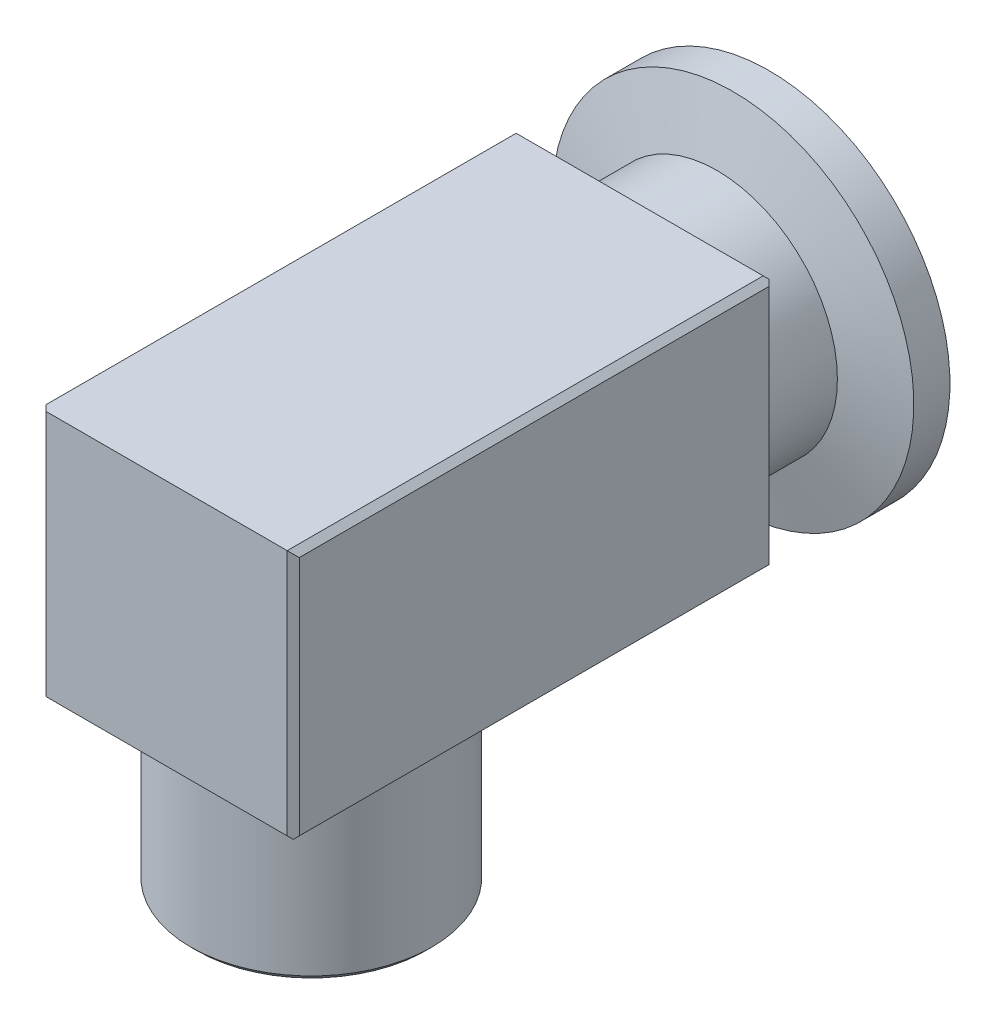
ISO-10303-21;
HEADER;
FILE_DESCRIPTION(('STEP AP214'),'2;1');
FILE_NAME('part.step','',(''),(''),'','','');
FILE_SCHEMA(('AUTOMOTIVE_DESIGN { 1 0 10303 214 1 1 1 1 }'));
ENDSEC;
DATA;
#1=APPLICATION_CONTEXT('core data for automotive mechanical design processes');
#2=APPLICATION_PROTOCOL_DEFINITION('international standard','automotive_design',2000,#1);
#3=PRODUCT_CONTEXT('',#1,'mechanical');
#4=PRODUCT('Part','Part','',(#3));
#5=PRODUCT_RELATED_PRODUCT_CATEGORY('part','',(#4));
#6=PRODUCT_DEFINITION_FORMATION('','',#4);
#7=PRODUCT_DEFINITION_CONTEXT('part definition',#1,'design');
#8=PRODUCT_DEFINITION('design','',#6,#7);
#9=PRODUCT_DEFINITION_SHAPE('','',#8);
#10=(LENGTH_UNIT() NAMED_UNIT(*) SI_UNIT(.MILLI.,.METRE.));
#11=(NAMED_UNIT(*) PLANE_ANGLE_UNIT() SI_UNIT($,.RADIAN.));
#12=(NAMED_UNIT(*) SI_UNIT($,.STERADIAN.) SOLID_ANGLE_UNIT());
#13=UNCERTAINTY_MEASURE_WITH_UNIT(LENGTH_MEASURE(1.E-05),#10,'distance_accuracy_value','');
#14=(GEOMETRIC_REPRESENTATION_CONTEXT(3) GLOBAL_UNCERTAINTY_ASSIGNED_CONTEXT((#13)) GLOBAL_UNIT_ASSIGNED_CONTEXT((#10,
#11,#12)) REPRESENTATION_CONTEXT('',''));
#15=CARTESIAN_POINT('',(0.,0.,0.));
#16=DIRECTION('',(0.,0.,1.));
#17=DIRECTION('',(1.,0.,0.));
#18=AXIS2_PLACEMENT_3D('',#15,#16,#17);
#19=CARTESIAN_POINT('',(10.25,-1.,-19.75));
#20=DIRECTION('',(0.707106781186548,0.,-0.707106781186548));
#21=DIRECTION('',(0.,-1.,0.));
#22=AXIS2_PLACEMENT_3D('',#19,#20,#21);
#23=PLANE('',#22);
#24=DIRECTION('',(0.,-1.,0.));
#25=VECTOR('',#24,1.);
#26=CARTESIAN_POINT('',(10.,9.,-20.));
#27=LINE('',#26,#25);
#28=CARTESIAN_POINT('',(10.,9.,-20.));
#29=VERTEX_POINT('',#28);
#30=CARTESIAN_POINT('',(10.,-1.,-20.));
#31=VERTEX_POINT('',#30);
#32=EDGE_CURVE('E231',#29,#31,#27,.T.);
#33=ORIENTED_EDGE('',*,*,#32,.F.);
#34=DIRECTION('',(-0.577350269189626,-0.577350269189626,-0.577350269189626));
#35=VECTOR('',#34,1.);
#36=CARTESIAN_POINT('',(10.25,9.25,-19.75));
#37=LINE('',#36,#35);
#38=CARTESIAN_POINT('',(10.25,9.25,-19.75));
#39=VERTEX_POINT('',#38);
#40=EDGE_CURVE('E219',#39,#29,#37,.T.);
#41=ORIENTED_EDGE('',*,*,#40,.F.);
#42=DIRECTION('',(-0.577350269189626,0.577350269189626,-0.577350269189626));
#43=VECTOR('',#42,1.);
#44=CARTESIAN_POINT('',(10.5,9.,-19.5));
#45=LINE('',#44,#43);
#46=CARTESIAN_POINT('',(10.5,9.,-19.5));
#47=VERTEX_POINT('',#46);
#48=EDGE_CURVE('E11',#47,#39,#45,.T.);
#49=ORIENTED_EDGE('',*,*,#48,.F.);
#50=DIRECTION('',(0.,-1.,0.));
#51=VECTOR('',#50,1.);
#52=CARTESIAN_POINT('',(10.5,9.,-19.5));
#53=LINE('',#52,#51);
#54=CARTESIAN_POINT('',(10.5,-11.,-19.5));
#55=VERTEX_POINT('',#54);
#56=EDGE_CURVE('E244',#47,#55,#53,.T.);
#57=ORIENTED_EDGE('',*,*,#56,.T.);
#58=DIRECTION('',(-0.577350269189626,-0.577350269189626,-0.577350269189626));
#59=VECTOR('',#58,1.);
#60=CARTESIAN_POINT('',(10.5,-11.,-19.5));
#61=LINE('',#60,#59);
#62=CARTESIAN_POINT('',(10.25,-11.25,-19.75));
#63=VERTEX_POINT('',#62);
#64=EDGE_CURVE('E223',#55,#63,#61,.T.);
#65=ORIENTED_EDGE('',*,*,#64,.T.);
#66=DIRECTION('',(-0.577350269189626,0.577350269189626,-0.577350269189626));
#67=VECTOR('',#66,1.);
#68=CARTESIAN_POINT('',(10.25,-11.25,-19.75));
#69=LINE('',#68,#67);
#70=CARTESIAN_POINT('',(10.,-11.,-20.));
#71=VERTEX_POINT('',#70);
#72=EDGE_CURVE('E275',#63,#71,#69,.T.);
#73=ORIENTED_EDGE('',*,*,#72,.T.);
#74=DIRECTION('',(0.,-1.,0.));
#75=VECTOR('',#74,1.);
#76=CARTESIAN_POINT('',(10.,-1.,-20.));
#77=LINE('',#76,#75);
#78=EDGE_CURVE('E235',#31,#71,#77,.T.);
#79=ORIENTED_EDGE('',*,*,#78,.F.);
#80=EDGE_LOOP('',(#33,#41,#49,#57,#65,#73,#79));
#81=FACE_BOUND('',#80,.T.);
#82=ADVANCED_FACE('F17',(#81),#23,.T.);
#83=CARTESIAN_POINT('',(10.25,9.25,0.));
#84=DIRECTION('',(0.707106781186548,0.707106781186548,0.));
#85=DIRECTION('',(0.,0.,-1.));
#86=AXIS2_PLACEMENT_3D('',#83,#84,#85);
#87=PLANE('',#86);
#88=DIRECTION('',(0.,0.,-1.));
#89=VECTOR('',#88,1.);
#90=CARTESIAN_POINT('',(10.,9.5,20.));
#91=LINE('',#90,#89);
#92=CARTESIAN_POINT('',(10.,9.5,20.));
#93=VERTEX_POINT('',#92);
#94=CARTESIAN_POINT('',(10.,9.5,-19.5));
#95=VERTEX_POINT('',#94);
#96=EDGE_CURVE('E402',#93,#95,#91,.T.);
#97=ORIENTED_EDGE('',*,*,#96,.F.);
#98=DIRECTION('',(0.577350269189626,-0.577350269189626,-0.577350269189626));
#99=VECTOR('',#98,1.);
#100=CARTESIAN_POINT('',(10.,9.5,20.));
#101=LINE('',#100,#99);
#102=CARTESIAN_POINT('',(10.5,9.,19.5));
#103=VERTEX_POINT('',#102);
#104=EDGE_CURVE('E366',#93,#103,#101,.T.);
#105=ORIENTED_EDGE('',*,*,#104,.T.);
#106=DIRECTION('',(0.,0.,-1.));
#107=VECTOR('',#106,1.);
#108=CARTESIAN_POINT('',(10.5,9.,19.5));
#109=LINE('',#108,#107);
#110=EDGE_CURVE('E363',#103,#47,#109,.T.);
#111=ORIENTED_EDGE('',*,*,#110,.T.);
#112=ORIENTED_EDGE('',*,*,#48,.T.);
#113=DIRECTION('',(0.577350269189626,-0.577350269189626,-0.577350269189626));
#114=VECTOR('',#113,1.);
#115=CARTESIAN_POINT('',(10.,9.5,-19.5));
#116=LINE('',#115,#114);
#117=EDGE_CURVE('E215',#95,#39,#116,.T.);
#118=ORIENTED_EDGE('',*,*,#117,.F.);
#119=EDGE_LOOP('',(#97,#105,#111,#112,#118));
#120=FACE_BOUND('',#119,.T.);
#121=ADVANCED_FACE('F513',(#120),#87,.T.);
#122=CARTESIAN_POINT('',(0.,-11.25,19.75));
#123=DIRECTION('',(0.,-0.707106781186548,0.707106781186548));
#124=DIRECTION('',(-1.,0.,0.));
#125=AXIS2_PLACEMENT_3D('',#122,#123,#124);
#126=PLANE('',#125);
#127=DIRECTION('',(1.,0.,0.));
#128=VECTOR('',#127,1.);
#129=CARTESIAN_POINT('',(-10.,-11.5,19.5));
#130=LINE('',#129,#128);
#131=CARTESIAN_POINT('',(-10.,-11.5,19.5));
#132=VERTEX_POINT('',#131);
#133=CARTESIAN_POINT('',(10.,-11.5,19.5));
#134=VERTEX_POINT('',#133);
#135=EDGE_CURVE('E151',#132,#134,#130,.T.);
#136=ORIENTED_EDGE('',*,*,#135,.T.);
#137=DIRECTION('',(-0.577350269189626,-0.577350269189626,-0.577350269189626));
#138=VECTOR('',#137,1.);
#139=CARTESIAN_POINT('',(10.25,-11.25,19.75));
#140=LINE('',#139,#138);
#141=CARTESIAN_POINT('',(10.25,-11.25,19.75));
#142=VERTEX_POINT('',#141);
#143=EDGE_CURVE('E124',#142,#134,#140,.T.);
#144=ORIENTED_EDGE('',*,*,#143,.F.);
#145=DIRECTION('',(0.577350269189626,-0.577350269189626,-0.577350269189626));
#146=VECTOR('',#145,1.);
#147=CARTESIAN_POINT('',(10.,-11.,20.));
#148=LINE('',#147,#146);
#149=CARTESIAN_POINT('',(10.,-11.,20.));
#150=VERTEX_POINT('',#149);
#151=EDGE_CURVE('E28',#150,#142,#148,.T.);
#152=ORIENTED_EDGE('',*,*,#151,.F.);
#153=DIRECTION('',(1.,0.,0.));
#154=VECTOR('',#153,1.);
#155=CARTESIAN_POINT('',(-10.,-11.,20.));
#156=LINE('',#155,#154);
#157=CARTESIAN_POINT('',(-10.,-11.,20.));
#158=VERTEX_POINT('',#157);
#159=EDGE_CURVE('E228',#158,#150,#156,.T.);
#160=ORIENTED_EDGE('',*,*,#159,.F.);
#161=DIRECTION('',(-0.577350269189626,-0.577350269189626,-0.577350269189626));
#162=VECTOR('',#161,1.);
#163=CARTESIAN_POINT('',(-10.,-11.,20.));
#164=LINE('',#163,#162);
#165=CARTESIAN_POINT('',(-10.25,-11.25,19.75));
#166=VERTEX_POINT('',#165);
#167=EDGE_CURVE('E362',#158,#166,#164,.T.);
#168=ORIENTED_EDGE('',*,*,#167,.T.);
#169=DIRECTION('',(-0.577350269189626,0.577350269189626,0.577350269189626));
#170=VECTOR('',#169,1.);
#171=CARTESIAN_POINT('',(-10.,-11.5,19.5));
#172=LINE('',#171,#170);
#173=EDGE_CURVE('E341',#132,#166,#172,.T.);
#174=ORIENTED_EDGE('',*,*,#173,.F.);
#175=EDGE_LOOP('',(#136,#144,#152,#160,#168,#174));
#176=FACE_BOUND('',#175,.T.);
#177=ADVANCED_FACE('F518',(#176),#126,.T.);
#178=CARTESIAN_POINT('',(10.25,-1.,19.75));
#179=DIRECTION('',(0.707106781186548,0.,0.707106781186548));
#180=DIRECTION('',(0.,-1.,0.));
#181=AXIS2_PLACEMENT_3D('',#178,#179,#180);
#182=PLANE('',#181);
#183=DIRECTION('',(0.,1.,0.));
#184=VECTOR('',#183,1.);
#185=CARTESIAN_POINT('',(10.5,-11.,19.5));
#186=LINE('',#185,#184);
#187=CARTESIAN_POINT('',(10.5,-11.,19.5));
#188=VERTEX_POINT('',#187);
#189=EDGE_CURVE('E240',#188,#103,#186,.T.);
#190=ORIENTED_EDGE('',*,*,#189,.T.);
#191=ORIENTED_EDGE('',*,*,#104,.F.);
#192=DIRECTION('',(0.,1.,0.));
#193=VECTOR('',#192,1.);
#194=CARTESIAN_POINT('',(10.,-11.,20.));
#195=LINE('',#194,#193);
#196=EDGE_CURVE('E300',#150,#93,#195,.T.);
#197=ORIENTED_EDGE('',*,*,#196,.F.);
#198=ORIENTED_EDGE('',*,*,#151,.T.);
#199=DIRECTION('',(-0.577350269189626,-0.577350269189626,0.577350269189626));
#200=VECTOR('',#199,1.);
#201=CARTESIAN_POINT('',(10.5,-11.,19.5));
#202=LINE('',#201,#200);
#203=EDGE_CURVE('E224',#188,#142,#202,.T.);
#204=ORIENTED_EDGE('',*,*,#203,.F.);
#205=EDGE_LOOP('',(#190,#191,#197,#198,#204));
#206=FACE_BOUND('',#205,.T.);
#207=ADVANCED_FACE('F596',(#206),#182,.T.);
#208=CARTESIAN_POINT('',(10.5,-11.5,-20.));
#209=DIRECTION('',(1.,0.,0.));
#210=DIRECTION('',(0.,1.,0.));
#211=AXIS2_PLACEMENT_3D('',#208,#209,#210);
#212=PLANE('',#211);
#213=ORIENTED_EDGE('',*,*,#189,.F.);
#214=DIRECTION('',(0.,0.,-1.));
#215=VECTOR('',#214,1.);
#216=CARTESIAN_POINT('',(10.5,-11.,19.5));
#217=LINE('',#216,#215);
#218=EDGE_CURVE('E328',#188,#55,#217,.T.);
#219=ORIENTED_EDGE('',*,*,#218,.T.);
#220=ORIENTED_EDGE('',*,*,#56,.F.);
#221=ORIENTED_EDGE('',*,*,#110,.F.);
#222=EDGE_LOOP('',(#213,#219,#220,#221));
#223=FACE_BOUND('',#222,.T.);
#224=ADVANCED_FACE('F530',(#223),#212,.T.);
#225=CARTESIAN_POINT('',(10.25,-11.25,0.));
#226=DIRECTION('',(0.707106781186548,-0.707106781186548,0.));
#227=DIRECTION('',(0.,0.,-1.));
#228=AXIS2_PLACEMENT_3D('',#225,#226,#227);
#229=PLANE('',#228);
#230=ORIENTED_EDGE('',*,*,#218,.F.);
#231=ORIENTED_EDGE('',*,*,#203,.T.);
#232=ORIENTED_EDGE('',*,*,#143,.T.);
#233=DIRECTION('',(0.,0.,-1.));
#234=VECTOR('',#233,1.);
#235=CARTESIAN_POINT('',(10.,-11.5,19.5));
#236=LINE('',#235,#234);
#237=CARTESIAN_POINT('',(10.,-11.5,8.));
#238=VERTEX_POINT('',#237);
#239=EDGE_CURVE('E157',#134,#238,#236,.T.);
#240=ORIENTED_EDGE('',*,*,#239,.T.);
#241=DIRECTION('',(0.,0.,-1.));
#242=VECTOR('',#241,1.);
#243=CARTESIAN_POINT('',(10.,-11.5,8.));
#244=LINE('',#243,#242);
#245=CARTESIAN_POINT('',(10.,-11.5,-19.5));
#246=VERTEX_POINT('',#245);
#247=EDGE_CURVE('E304',#238,#246,#244,.T.);
#248=ORIENTED_EDGE('',*,*,#247,.T.);
#249=DIRECTION('',(0.577350269189626,0.577350269189626,-0.577350269189626));
#250=VECTOR('',#249,1.);
#251=CARTESIAN_POINT('',(10.,-11.5,-19.5));
#252=LINE('',#251,#250);
#253=EDGE_CURVE('E331',#246,#63,#252,.T.);
#254=ORIENTED_EDGE('',*,*,#253,.T.);
#255=ORIENTED_EDGE('',*,*,#64,.F.);
#256=EDGE_LOOP('',(#230,#231,#232,#240,#248,#254,#255));
#257=FACE_BOUND('',#256,.T.);
#258=ADVANCED_FACE('F525',(#257),#229,.T.);
#259=CARTESIAN_POINT('',(0.,-11.25,-19.75));
#260=DIRECTION('',(0.,-0.707106781186548,-0.707106781186548));
#261=DIRECTION('',(0.,-0.707106781186548,0.707106781186548));
#262=AXIS2_PLACEMENT_3D('',#259,#260,#261);
#263=PLANE('',#262);
#264=DIRECTION('',(-1.,0.,0.));
#265=VECTOR('',#264,1.);
#266=CARTESIAN_POINT('',(10.,-11.,-20.));
#267=LINE('',#266,#265);
#268=CARTESIAN_POINT('',(0.,-11.,-20.));
#269=VERTEX_POINT('',#268);
#270=EDGE_CURVE('E312',#71,#269,#267,.T.);
#271=ORIENTED_EDGE('',*,*,#270,.F.);
#272=ORIENTED_EDGE('',*,*,#72,.F.);
#273=ORIENTED_EDGE('',*,*,#253,.F.);
#274=DIRECTION('',(-1.,0.,0.));
#275=VECTOR('',#274,1.);
#276=CARTESIAN_POINT('',(10.,-11.5,-19.5));
#277=LINE('',#276,#275);
#278=CARTESIAN_POINT('',(-10.,-11.5,-19.5));
#279=VERTEX_POINT('',#278);
#280=EDGE_CURVE('E301',#246,#279,#277,.T.);
#281=ORIENTED_EDGE('',*,*,#280,.T.);
#282=DIRECTION('',(-0.577350269189626,0.577350269189626,-0.577350269189626));
#283=VECTOR('',#282,1.);
#284=CARTESIAN_POINT('',(-10.,-11.5,-19.5));
#285=LINE('',#284,#283);
#286=CARTESIAN_POINT('',(-10.25,-11.25,-19.75));
#287=VERTEX_POINT('',#286);
#288=EDGE_CURVE('E203',#279,#287,#285,.T.);
#289=ORIENTED_EDGE('',*,*,#288,.T.);
#290=DIRECTION('',(0.577350269189626,0.577350269189626,-0.577350269189626));
#291=VECTOR('',#290,1.);
#292=CARTESIAN_POINT('',(-10.25,-11.25,-19.75));
#293=LINE('',#292,#291);
#294=CARTESIAN_POINT('',(-10.,-11.,-20.));
#295=VERTEX_POINT('',#294);
#296=EDGE_CURVE('E264',#287,#295,#293,.T.);
#297=ORIENTED_EDGE('',*,*,#296,.T.);
#298=DIRECTION('',(-1.,0.,0.));
#299=VECTOR('',#298,1.);
#300=CARTESIAN_POINT('',(0.,-11.,-20.));
#301=LINE('',#300,#299);
#302=EDGE_CURVE('E255',#269,#295,#301,.T.);
#303=ORIENTED_EDGE('',*,*,#302,.F.);
#304=EDGE_LOOP('',(#271,#272,#273,#281,#289,#297,#303));
#305=FACE_BOUND('',#304,.T.);
#306=ADVANCED_FACE('F507',(#305),#263,.T.);
#307=CARTESIAN_POINT('',(-10.25,-1.,-19.75));
#308=DIRECTION('',(-0.707106781186548,0.,-0.707106781186548));
#309=DIRECTION('',(-0.707106781186548,0.,0.707106781186548));
#310=AXIS2_PLACEMENT_3D('',#307,#308,#309);
#311=PLANE('',#310);
#312=DIRECTION('',(0.,1.,0.));
#313=VECTOR('',#312,1.);
#314=CARTESIAN_POINT('',(-10.5,-11.,-19.5));
#315=LINE('',#314,#313);
#316=CARTESIAN_POINT('',(-10.5,-11.,-19.5));
#317=VERTEX_POINT('',#316);
#318=CARTESIAN_POINT('',(-10.5,9.5,-19.5));
#319=VERTEX_POINT('',#318);
#320=EDGE_CURVE('E214',#317,#319,#315,.T.);
#321=ORIENTED_EDGE('',*,*,#320,.T.);
#322=DIRECTION('',(0.577350269189626,-0.577350269189626,-0.577350269189626));
#323=VECTOR('',#322,1.);
#324=CARTESIAN_POINT('',(-10.5,9.5,-19.5));
#325=LINE('',#324,#323);
#326=CARTESIAN_POINT('',(-10.,9.,-20.));
#327=VERTEX_POINT('',#326);
#328=EDGE_CURVE('E257',#319,#327,#325,.T.);
#329=ORIENTED_EDGE('',*,*,#328,.T.);
#330=DIRECTION('',(0.,1.,0.));
#331=VECTOR('',#330,1.);
#332=CARTESIAN_POINT('',(-10.,-1.,-20.));
#333=LINE('',#332,#331);
#334=CARTESIAN_POINT('',(-10.,-1.,-20.));
#335=VERTEX_POINT('',#334);
#336=EDGE_CURVE('E254',#335,#327,#333,.T.);
#337=ORIENTED_EDGE('',*,*,#336,.F.);
#338=DIRECTION('',(0.,1.,0.));
#339=VECTOR('',#338,1.);
#340=CARTESIAN_POINT('',(-10.,-11.,-20.));
#341=LINE('',#340,#339);
#342=EDGE_CURVE('E251',#295,#335,#341,.T.);
#343=ORIENTED_EDGE('',*,*,#342,.F.);
#344=ORIENTED_EDGE('',*,*,#296,.F.);
#345=DIRECTION('',(0.577350269189626,-0.577350269189626,-0.577350269189626));
#346=VECTOR('',#345,1.);
#347=CARTESIAN_POINT('',(-10.5,-11.,-19.5));
#348=LINE('',#347,#346);
#349=EDGE_CURVE('E334',#317,#287,#348,.T.);
#350=ORIENTED_EDGE('',*,*,#349,.F.);
#351=EDGE_LOOP('',(#321,#329,#337,#343,#344,#350));
#352=FACE_BOUND('',#351,.T.);
#353=ADVANCED_FACE('F501',(#352),#311,.T.);
#354=CARTESIAN_POINT('',(0.,9.25,-19.75));
#355=DIRECTION('',(0.,0.707106781186548,-0.707106781186548));
#356=DIRECTION('',(-1.,0.,0.));
#357=AXIS2_PLACEMENT_3D('',#354,#355,#356);
#358=PLANE('',#357);
#359=DIRECTION('',(1.,0.,0.));
#360=VECTOR('',#359,1.);
#361=CARTESIAN_POINT('',(-10.5,9.5,-19.5));
#362=LINE('',#361,#360);
#363=EDGE_CURVE('E406',#319,#95,#362,.T.);
#364=ORIENTED_EDGE('',*,*,#363,.T.);
#365=ORIENTED_EDGE('',*,*,#117,.T.);
#366=ORIENTED_EDGE('',*,*,#40,.T.);
#367=DIRECTION('',(1.,0.,0.));
#368=VECTOR('',#367,1.);
#369=CARTESIAN_POINT('',(0.,9.,-20.));
#370=LINE('',#369,#368);
#371=CARTESIAN_POINT('',(0.,9.,-20.));
#372=VERTEX_POINT('',#371);
#373=EDGE_CURVE('E236',#372,#29,#370,.T.);
#374=ORIENTED_EDGE('',*,*,#373,.F.);
#375=DIRECTION('',(1.,0.,0.));
#376=VECTOR('',#375,1.);
#377=CARTESIAN_POINT('',(-10.,9.,-20.));
#378=LINE('',#377,#376);
#379=EDGE_CURVE('E220',#327,#372,#378,.T.);
#380=ORIENTED_EDGE('',*,*,#379,.F.);
#381=ORIENTED_EDGE('',*,*,#328,.F.);
#382=EDGE_LOOP('',(#364,#365,#366,#374,#380,#381));
#383=FACE_BOUND('',#382,.T.);
#384=ADVANCED_FACE('F506',(#383),#358,.T.);
#385=CARTESIAN_POINT('',(0.,0.,-20.));
#386=DIRECTION('',(0.,0.,1.));
#387=DIRECTION('',(1.,0.,0.));
#388=AXIS2_PLACEMENT_3D('',#385,#386,#387);
#389=PLANE('',#388);
#390=CARTESIAN_POINT('',(0.,-1.,-20.));
#391=DIRECTION('',(0.,0.,-1.));
#392=DIRECTION('',(-1.,0.,0.));
#393=AXIS2_PLACEMENT_3D('',#390,#391,#392);
#394=CIRCLE('',#393,10.);
#395=EDGE_CURVE('E323',#335,#372,#394,.T.);
#396=ORIENTED_EDGE('',*,*,#395,.F.);
#397=ORIENTED_EDGE('',*,*,#336,.T.);
#398=ORIENTED_EDGE('',*,*,#379,.T.);
#399=EDGE_LOOP('',(#396,#397,#398));
#400=FACE_BOUND('',#399,.T.);
#401=ADVANCED_FACE('F551',(#400),#389,.F.);
#402=CARTESIAN_POINT('',(0.,0.,-20.));
#403=DIRECTION('',(0.,0.,1.));
#404=DIRECTION('',(1.,0.,0.));
#405=AXIS2_PLACEMENT_3D('',#402,#403,#404);
#406=PLANE('',#405);
#407=CARTESIAN_POINT('',(0.,-1.,-20.));
#408=DIRECTION('',(0.,0.,-1.));
#409=DIRECTION('',(0.,-1.,0.));
#410=AXIS2_PLACEMENT_3D('',#407,#408,#409);
#411=CIRCLE('',#410,10.);
#412=EDGE_CURVE('E295',#269,#335,#411,.T.);
#413=ORIENTED_EDGE('',*,*,#412,.F.);
#414=ORIENTED_EDGE('',*,*,#302,.T.);
#415=ORIENTED_EDGE('',*,*,#342,.T.);
#416=EDGE_LOOP('',(#413,#414,#415));
#417=FACE_BOUND('',#416,.T.);
#418=ADVANCED_FACE('F690',(#417),#406,.F.);
#419=CARTESIAN_POINT('',(0.,0.,-20.));
#420=DIRECTION('',(0.,0.,1.));
#421=DIRECTION('',(1.,0.,0.));
#422=AXIS2_PLACEMENT_3D('',#419,#420,#421);
#423=PLANE('',#422);
#424=ORIENTED_EDGE('',*,*,#78,.T.);
#425=ORIENTED_EDGE('',*,*,#270,.T.);
#426=CARTESIAN_POINT('',(0.,-1.,-20.));
#427=DIRECTION('',(0.,0.,-1.));
#428=DIRECTION('',(1.,0.,0.));
#429=AXIS2_PLACEMENT_3D('',#426,#427,#428);
#430=CIRCLE('',#429,10.);
#431=EDGE_CURVE('E291',#31,#269,#430,.T.);
#432=ORIENTED_EDGE('',*,*,#431,.F.);
#433=EDGE_LOOP('',(#424,#425,#432));
#434=FACE_BOUND('',#433,.T.);
#435=ADVANCED_FACE('F19',(#434),#423,.F.);
#436=CARTESIAN_POINT('',(0.,0.,-20.));
#437=DIRECTION('',(0.,0.,1.));
#438=DIRECTION('',(1.,0.,0.));
#439=AXIS2_PLACEMENT_3D('',#436,#437,#438);
#440=PLANE('',#439);
#441=ORIENTED_EDGE('',*,*,#373,.T.);
#442=ORIENTED_EDGE('',*,*,#32,.T.);
#443=CARTESIAN_POINT('',(0.,-1.,-20.));
#444=DIRECTION('',(0.,0.,-1.));
#445=DIRECTION('',(0.,1.,0.));
#446=AXIS2_PLACEMENT_3D('',#443,#444,#445);
#447=CIRCLE('',#446,10.);
#448=EDGE_CURVE('E296',#372,#31,#447,.T.);
#449=ORIENTED_EDGE('',*,*,#448,.F.);
#450=EDGE_LOOP('',(#441,#442,#449));
#451=FACE_BOUND('',#450,.T.);
#452=ADVANCED_FACE('F541',(#451),#440,.F.);
#453=CARTESIAN_POINT('',(0.,-1.,-19.5));
#454=DIRECTION('',(0.,0.,-1.));
#455=DIRECTION('',(1.,0.,0.));
#456=AXIS2_PLACEMENT_3D('',#453,#454,#455);
#457=CYLINDRICAL_SURFACE('',#456,10.);
#458=CARTESIAN_POINT('',(0.,-1.,-25.66025403784));
#459=DIRECTION('',(0.,0.,-1.));
#460=DIRECTION('',(-1.,0.,0.));
#461=AXIS2_PLACEMENT_3D('',#458,#459,#460);
#462=CIRCLE('',#461,10.);
#463=CARTESIAN_POINT('',(-9.99999999999945,-1.,-25.660254037842));
#464=VERTEX_POINT('',#463);
#465=EDGE_CURVE('E21',#464,#464,#462,.T.);
#466=ORIENTED_EDGE('',*,*,#465,.F.);
#467=DIRECTION('',(0.,0.,1.));
#468=VECTOR('',#467,1.);
#469=CARTESIAN_POINT('',(-10.,-1.,-19.5));
#470=LINE('',#469,#468);
#471=EDGE_CURVE('E498',#464,#335,#470,.T.);
#472=ORIENTED_EDGE('',*,*,#471,.T.);
#473=ORIENTED_EDGE('',*,*,#395,.T.);
#474=ORIENTED_EDGE('',*,*,#448,.T.);
#475=ORIENTED_EDGE('',*,*,#431,.T.);
#476=ORIENTED_EDGE('',*,*,#412,.T.);
#477=ORIENTED_EDGE('',*,*,#471,.F.);
#478=EDGE_LOOP('',(#466,#472,#473,#474,#475,#476,#477));
#479=FACE_BOUND('',#478,.T.);
#480=ADVANCED_FACE('F535',(#479),#457,.T.);
#481=CARTESIAN_POINT('',(0.,-1.,-26.33012701892));
#482=DIRECTION('',(0.,0.,-1.));
#483=DIRECTION('',(1.,0.,0.));
#484=AXIS2_PLACEMENT_3D('',#481,#482,#483);
#485=CONICAL_SURFACE('',#484,12.5,1.30899693899575);
#486=CARTESIAN_POINT('',(0.,-1.,-27.));
#487=DIRECTION('',(0.,0.,-1.));
#488=DIRECTION('',(-1.,0.,0.));
#489=AXIS2_PLACEMENT_3D('',#486,#487,#488);
#490=CIRCLE('',#489,15.);
#491=CARTESIAN_POINT('',(-15.,-1.,-27.));
#492=VERTEX_POINT('',#491);
#493=EDGE_CURVE('E290',#492,#492,#490,.T.);
#494=ORIENTED_EDGE('',*,*,#493,.F.);
#495=DIRECTION('',(0.965925826289068,0.,0.258819045102521));
#496=VECTOR('',#495,1.);
#497=CARTESIAN_POINT('',(-12.5,-1.,-26.33012701892));
#498=LINE('',#497,#496);
#499=EDGE_CURVE('E286',#492,#464,#498,.T.);
#500=ORIENTED_EDGE('',*,*,#499,.T.);
#501=ORIENTED_EDGE('',*,*,#465,.T.);
#502=ORIENTED_EDGE('',*,*,#499,.F.);
#503=EDGE_LOOP('',(#494,#500,#501,#502));
#504=FACE_BOUND('',#503,.T.);
#505=ADVANCED_FACE('F540',(#504),#485,.T.);
#506=CARTESIAN_POINT('',(0.,-1.,-19.5));
#507=DIRECTION('',(0.,0.,-1.));
#508=DIRECTION('',(1.,0.,0.));
#509=AXIS2_PLACEMENT_3D('',#506,#507,#508);
#510=CYLINDRICAL_SURFACE('',#509,15.);
#511=CARTESIAN_POINT('',(0.,-1.,-30.));
#512=DIRECTION('',(0.,0.,-1.));
#513=DIRECTION('',(-1.,0.,0.));
#514=AXIS2_PLACEMENT_3D('',#511,#512,#513);
#515=CIRCLE('',#514,15.);
#516=CARTESIAN_POINT('',(-15.,-1.,-30.));
#517=VERTEX_POINT('',#516);
#518=EDGE_CURVE('E192',#517,#517,#515,.T.);
#519=ORIENTED_EDGE('',*,*,#518,.F.);
#520=DIRECTION('',(0.,0.,1.));
#521=VECTOR('',#520,1.);
#522=CARTESIAN_POINT('',(-15.,-1.,-19.5));
#523=LINE('',#522,#521);
#524=EDGE_CURVE('E327',#517,#492,#523,.T.);
#525=ORIENTED_EDGE('',*,*,#524,.T.);
#526=ORIENTED_EDGE('',*,*,#493,.T.);
#527=ORIENTED_EDGE('',*,*,#524,.F.);
#528=EDGE_LOOP('',(#519,#525,#526,#527));
#529=FACE_BOUND('',#528,.T.);
#530=ADVANCED_FACE('F696',(#529),#510,.T.);
#531=CARTESIAN_POINT('',(0.,-1.,-30.));
#532=DIRECTION('',(0.,0.,-1.));
#533=DIRECTION('',(0.,-1.,0.));
#534=AXIS2_PLACEMENT_3D('',#531,#532,#533);
#535=PLANE('',#534);
#536=CARTESIAN_POINT('',(0.,-1.,-30.));
#537=DIRECTION('',(0.,0.,-1.));
#538=DIRECTION('',(-1.,0.,0.));
#539=AXIS2_PLACEMENT_3D('',#536,#537,#538);
#540=CIRCLE('',#539,8.75);
#541=CARTESIAN_POINT('',(-8.75,-1.,-30.));
#542=VERTEX_POINT('',#541);
#543=EDGE_CURVE('E194',#542,#542,#540,.T.);
#544=ORIENTED_EDGE('',*,*,#543,.F.);
#545=EDGE_LOOP('',(#544));
#546=FACE_BOUND('',#545,.T.);
#547=ORIENTED_EDGE('',*,*,#518,.T.);
#548=EDGE_LOOP('',(#547));
#549=FACE_BOUND('',#548,.T.);
#550=ADVANCED_FACE('F701',(#546,#549),#535,.T.);
#551=CARTESIAN_POINT('',(0.,-1.,-19.5));
#552=DIRECTION('',(0.,0.,-1.));
#553=DIRECTION('',(1.,0.,0.));
#554=AXIS2_PLACEMENT_3D('',#551,#552,#553);
#555=CYLINDRICAL_SURFACE('',#554,8.75);
#556=CARTESIAN_POINT('',(0.,-1.,-27.4));
#557=DIRECTION('',(0.,0.,-1.));
#558=DIRECTION('',(-1.,0.,0.));
#559=AXIS2_PLACEMENT_3D('',#556,#557,#558);
#560=CIRCLE('',#559,8.75);
#561=CARTESIAN_POINT('',(-8.75,-1.,-27.4));
#562=VERTEX_POINT('',#561);
#563=EDGE_CURVE('E352',#562,#562,#560,.T.);
#564=ORIENTED_EDGE('',*,*,#563,.F.);
#565=DIRECTION('',(0.,0.,-1.));
#566=VECTOR('',#565,1.);
#567=CARTESIAN_POINT('',(-8.75,-1.,-19.5));
#568=LINE('',#567,#566);
#569=EDGE_CURVE('E198',#562,#542,#568,.T.);
#570=ORIENTED_EDGE('',*,*,#569,.T.);
#571=ORIENTED_EDGE('',*,*,#543,.T.);
#572=ORIENTED_EDGE('',*,*,#569,.F.);
#573=EDGE_LOOP('',(#564,#570,#571,#572));
#574=FACE_BOUND('',#573,.T.);
#575=ADVANCED_FACE('F667',(#574),#555,.F.);
#576=CARTESIAN_POINT('',(0.,-1.,-27.4));
#577=DIRECTION('',(0.,0.,-1.));
#578=DIRECTION('',(0.,-1.,0.));
#579=AXIS2_PLACEMENT_3D('',#576,#577,#578);
#580=PLANE('',#579);
#581=CARTESIAN_POINT('',(0.,-1.,-27.4));
#582=DIRECTION('',(0.,0.,1.));
#583=DIRECTION('',(-1.,0.,0.));
#584=AXIS2_PLACEMENT_3D('',#581,#582,#583);
#585=CIRCLE('',#584,8.);
#586=CARTESIAN_POINT('',(-8.,-1.,-27.4));
#587=VERTEX_POINT('',#586);
#588=EDGE_CURVE('E164',#587,#587,#585,.T.);
#589=ORIENTED_EDGE('',*,*,#588,.T.);
#590=EDGE_LOOP('',(#589));
#591=FACE_BOUND('',#590,.T.);
#592=ORIENTED_EDGE('',*,*,#563,.T.);
#593=EDGE_LOOP('',(#592));
#594=FACE_BOUND('',#593,.T.);
#595=ADVANCED_FACE('F651',(#591,#594),#580,.T.);
#596=CARTESIAN_POINT('',(0.,0.,8.));
#597=DIRECTION('',(0.,0.,-1.));
#598=DIRECTION('',(0.,-1.,0.));
#599=AXIS2_PLACEMENT_3D('',#596,#597,#598);
#600=PLANE('',#599);
#601=CARTESIAN_POINT('',(0.,-1.,8.));
#602=DIRECTION('',(0.,0.,-1.));
#603=DIRECTION('',(-0.347985272676897,0.9375,0.));
#604=AXIS2_PLACEMENT_3D('',#601,#602,#603);
#605=CIRCLE('',#604,8.);
#606=CARTESIAN_POINT('',(-2.783882181415,6.5,8.));
#607=VERTEX_POINT('',#606);
#608=CARTESIAN_POINT('',(2.783882181415,6.5,8.));
#609=VERTEX_POINT('',#608);
#610=EDGE_CURVE('E178',#607,#609,#605,.T.);
#611=ORIENTED_EDGE('',*,*,#610,.T.);
#612=DIRECTION('',(-1.,0.,0.));
#613=VECTOR('',#612,1.);
#614=CARTESIAN_POINT('',(2.783882181415,6.5,8.));
#615=LINE('',#614,#613);
#616=EDGE_CURVE('E175',#609,#607,#615,.T.);
#617=ORIENTED_EDGE('',*,*,#616,.T.);
#618=EDGE_LOOP('',(#611,#617));
#619=FACE_BOUND('',#618,.T.);
#620=ADVANCED_FACE('F646',(#619),#600,.T.);
#621=CARTESIAN_POINT('',(0.,6.5,-20.));
#622=DIRECTION('',(0.,-1.,0.));
#623=DIRECTION('',(0.,0.,-1.));
#624=AXIS2_PLACEMENT_3D('',#621,#622,#623);
#625=PLANE('',#624);
#626=CARTESIAN_POINT('',(0.,6.5,8.));
#627=DIRECTION('',(0.,-1.,0.));
#628=DIRECTION('',(0.347985272676897,0.,-0.9375));
#629=AXIS2_PLACEMENT_3D('',#626,#627,#628);
#630=CIRCLE('',#629,8.);
#631=CARTESIAN_POINT('',(2.783882181415,6.5,0.5));
#632=VERTEX_POINT('',#631);
#633=CARTESIAN_POINT('',(8.,6.5,8.));
#634=VERTEX_POINT('',#633);
#635=EDGE_CURVE('E208',#632,#634,#630,.T.);
#636=ORIENTED_EDGE('',*,*,#635,.T.);
#637=CARTESIAN_POINT('',(0.,6.5,8.));
#638=DIRECTION('',(0.,-1.,0.));
#639=DIRECTION('',(0.347985272676897,0.,-0.9375));
#640=AXIS2_PLACEMENT_3D('',#637,#638,#639);
#641=CIRCLE('',#640,8.);
#642=CARTESIAN_POINT('',(-2.783882181415,6.5,0.5));
#643=VERTEX_POINT('',#642);
#644=EDGE_CURVE('E249',#634,#643,#641,.T.);
#645=ORIENTED_EDGE('',*,*,#644,.T.);
#646=DIRECTION('',(0.,0.,-1.));
#647=VECTOR('',#646,1.);
#648=CARTESIAN_POINT('',(-2.783882181415,6.5,8.));
#649=LINE('',#648,#647);
#650=EDGE_CURVE('E165',#607,#643,#649,.T.);
#651=ORIENTED_EDGE('',*,*,#650,.F.);
#652=ORIENTED_EDGE('',*,*,#616,.F.);
#653=DIRECTION('',(0.,0.,-1.));
#654=VECTOR('',#653,1.);
#655=CARTESIAN_POINT('',(2.783882181415,6.5,8.));
#656=LINE('',#655,#654);
#657=EDGE_CURVE('E188',#609,#632,#656,.T.);
#658=ORIENTED_EDGE('',*,*,#657,.T.);
#659=EDGE_LOOP('',(#636,#645,#651,#652,#658));
#660=FACE_BOUND('',#659,.T.);
#661=ADVANCED_FACE('F608',(#660),#625,.T.);
#662=CARTESIAN_POINT('',(0.,-1.,-19.5));
#663=DIRECTION('',(0.,0.,-1.));
#664=DIRECTION('',(1.,0.,0.));
#665=AXIS2_PLACEMENT_3D('',#662,#663,#664);
#666=CYLINDRICAL_SURFACE('',#665,8.);
#667=CARTESIAN_POINT('',(0.,-1.,8.));
#668=DIRECTION('',(0.,0.707106781186548,-0.707106781186548));
#669=DIRECTION('',(0.,-0.707106781186548,-0.707106781186548));
#670=AXIS2_PLACEMENT_3D('',#667,#668,#669);
#671=ELLIPSE('',#670,11.3137084989848,8.);
#672=CARTESIAN_POINT('',(8.,-1.,8.));
#673=VERTEX_POINT('',#672);
#674=CARTESIAN_POINT('',(-8.,-1.,8.));
#675=VERTEX_POINT('',#674);
#676=EDGE_CURVE('E250',#673,#675,#671,.T.);
#677=ORIENTED_EDGE('',*,*,#676,.F.);
#678=CARTESIAN_POINT('',(0.,-1.,8.));
#679=DIRECTION('',(0.,-0.707106781186548,-0.707106781186547));
#680=DIRECTION('',(0.,-0.707106781186547,0.707106781186548));
#681=AXIS2_PLACEMENT_3D('',#678,#679,#680);
#682=ELLIPSE('',#681,11.3137084989848,8.);
#683=EDGE_CURVE('E229',#632,#673,#682,.T.);
#684=ORIENTED_EDGE('',*,*,#683,.F.);
#685=ORIENTED_EDGE('',*,*,#657,.F.);
#686=ORIENTED_EDGE('',*,*,#610,.F.);
#687=ORIENTED_EDGE('',*,*,#650,.T.);
#688=CARTESIAN_POINT('',(0.,-1.,8.));
#689=DIRECTION('',(0.,-0.707106781186548,-0.707106781186547));
#690=DIRECTION('',(0.,-0.707106781186547,0.707106781186548));
#691=AXIS2_PLACEMENT_3D('',#688,#689,#690);
#692=ELLIPSE('',#691,11.3137084989848,8.);
#693=EDGE_CURVE('E245',#675,#643,#692,.T.);
#694=ORIENTED_EDGE('',*,*,#693,.F.);
#695=DIRECTION('',(0.,0.,-1.));
#696=VECTOR('',#695,1.);
#697=CARTESIAN_POINT('',(-8.,-1.,-19.5));
#698=LINE('',#697,#696);
#699=EDGE_CURVE('E161',#675,#587,#698,.T.);
#700=ORIENTED_EDGE('',*,*,#699,.T.);
#701=ORIENTED_EDGE('',*,*,#588,.F.);
#702=ORIENTED_EDGE('',*,*,#699,.F.);
#703=EDGE_LOOP('',(#677,#684,#685,#686,#687,#694,#700,#701,#702));
#704=FACE_BOUND('',#703,.T.);
#705=ADVANCED_FACE('F602',(#704),#666,.F.);
#706=CARTESIAN_POINT('',(0.,-10.8,8.));
#707=DIRECTION('',(0.,-1.,0.));
#708=DIRECTION('',(-1.,0.,0.));
#709=AXIS2_PLACEMENT_3D('',#706,#707,#708);
#710=CYLINDRICAL_SURFACE('',#709,8.);
#711=DIRECTION('',(0.,-1.,0.));
#712=VECTOR('',#711,1.);
#713=CARTESIAN_POINT('',(8.,-10.8,8.));
#714=LINE('',#713,#712);
#715=CARTESIAN_POINT('',(8.,-25.5,8.));
#716=VERTEX_POINT('',#715);
#717=EDGE_CURVE('E305',#673,#716,#714,.T.);
#718=ORIENTED_EDGE('',*,*,#717,.F.);
#719=ORIENTED_EDGE('',*,*,#676,.T.);
#720=ORIENTED_EDGE('',*,*,#693,.T.);
#721=ORIENTED_EDGE('',*,*,#644,.F.);
#722=DIRECTION('',(0.,-1.,0.));
#723=VECTOR('',#722,1.);
#724=CARTESIAN_POINT('',(8.,-10.8,8.));
#725=LINE('',#724,#723);
#726=EDGE_CURVE('E204',#634,#673,#725,.T.);
#727=ORIENTED_EDGE('',*,*,#726,.T.);
#728=ORIENTED_EDGE('',*,*,#717,.T.);
#729=CARTESIAN_POINT('',(0.,-25.5,8.));
#730=DIRECTION('',(0.,1.,0.));
#731=DIRECTION('',(1.,0.,0.));
#732=AXIS2_PLACEMENT_3D('',#729,#730,#731);
#733=CIRCLE('',#732,8.);
#734=EDGE_CURVE('E308',#716,#716,#733,.T.);
#735=ORIENTED_EDGE('',*,*,#734,.F.);
#736=EDGE_LOOP('',(#718,#719,#720,#721,#727,#728,#735));
#737=FACE_BOUND('',#736,.T.);
#738=ADVANCED_FACE('F607',(#737),#710,.F.);
#739=CARTESIAN_POINT('',(0.,-25.5,8.));
#740=DIRECTION('',(0.,-1.,0.));
#741=DIRECTION('',(0.,0.,-1.));
#742=AXIS2_PLACEMENT_3D('',#739,#740,#741);
#743=PLANE('',#742);
#744=ORIENTED_EDGE('',*,*,#734,.T.);
#745=EDGE_LOOP('',(#744));
#746=FACE_BOUND('',#745,.T.);
#747=CARTESIAN_POINT('',(0.,-25.5,8.));
#748=DIRECTION('',(0.,1.,0.));
#749=DIRECTION('',(1.,0.,0.));
#750=AXIS2_PLACEMENT_3D('',#747,#748,#749);
#751=CIRCLE('',#750,9.5);
#752=CARTESIAN_POINT('',(0.,-25.499999999999,17.499999999999));
#753=VERTEX_POINT('',#752);
#754=EDGE_CURVE('E370',#753,#753,#751,.T.);
#755=ORIENTED_EDGE('',*,*,#754,.F.);
#756=EDGE_LOOP('',(#755));
#757=FACE_BOUND('',#756,.T.);
#758=ADVANCED_FACE('F566',(#746,#757),#743,.T.);
#759=CARTESIAN_POINT('',(0.,-25.25000000025,8.));
#760=DIRECTION('',(0.,1.,0.));
#761=DIRECTION('',(0.,0.,-1.));
#762=AXIS2_PLACEMENT_3D('',#759,#760,#761);
#763=CONICAL_SURFACE('',#762,9.749999999748,0.785398163397448);
#764=CARTESIAN_POINT('',(0.,-25.,8.));
#765=DIRECTION('',(0.,1.,0.));
#766=DIRECTION('',(1.,0.,0.));
#767=AXIS2_PLACEMENT_3D('',#764,#765,#766);
#768=CIRCLE('',#767,10.);
#769=CARTESIAN_POINT('',(10.,-25.,8.));
#770=VERTEX_POINT('',#769);
#771=CARTESIAN_POINT('',(0.,-24.999999999999,17.999999999999));
#772=VERTEX_POINT('',#771);
#773=EDGE_CURVE('E136',#770,#772,#768,.T.);
#774=ORIENTED_EDGE('',*,*,#773,.F.);
#775=CARTESIAN_POINT('',(0.,-25.,8.));
#776=DIRECTION('',(0.,1.,0.));
#777=DIRECTION('',(1.,0.,0.));
#778=AXIS2_PLACEMENT_3D('',#775,#776,#777);
#779=CIRCLE('',#778,10.);
#780=EDGE_CURVE('E141',#772,#770,#779,.T.);
#781=ORIENTED_EDGE('',*,*,#780,.F.);
#782=DIRECTION('',(0.,-0.707106781186548,-0.707106781186548));
#783=VECTOR('',#782,1.);
#784=CARTESIAN_POINT('',(0.,-25.25000000025,17.749999999748));
#785=LINE('',#784,#783);
#786=EDGE_CURVE('E140',#772,#753,#785,.T.);
#787=ORIENTED_EDGE('',*,*,#786,.T.);
#788=ORIENTED_EDGE('',*,*,#754,.T.);
#789=ORIENTED_EDGE('',*,*,#786,.F.);
#790=EDGE_LOOP('',(#774,#781,#787,#788,#789));
#791=FACE_BOUND('',#790,.T.);
#792=ADVANCED_FACE('F148',(#791),#763,.T.);
#793=CARTESIAN_POINT('',(0.,-10.8,8.));
#794=DIRECTION('',(0.,-1.,0.));
#795=DIRECTION('',(-1.,0.,0.));
#796=AXIS2_PLACEMENT_3D('',#793,#794,#795);
#797=CYLINDRICAL_SURFACE('',#796,10.);
#798=ORIENTED_EDGE('',*,*,#773,.T.);
#799=ORIENTED_EDGE('',*,*,#780,.T.);
#800=DIRECTION('',(0.,1.,0.));
#801=VECTOR('',#800,1.);
#802=CARTESIAN_POINT('',(10.,-10.8,8.));
#803=LINE('',#802,#801);
#804=EDGE_CURVE('E132',#770,#238,#803,.T.);
#805=ORIENTED_EDGE('',*,*,#804,.T.);
#806=CARTESIAN_POINT('',(0.,-11.5,8.));
#807=DIRECTION('',(0.,-1.,0.));
#808=DIRECTION('',(1.,0.,0.));
#809=AXIS2_PLACEMENT_3D('',#806,#807,#808);
#810=CIRCLE('',#809,10.);
#811=CARTESIAN_POINT('',(-10.,-11.5,8.));
#812=VERTEX_POINT('',#811);
#813=EDGE_CURVE('E407',#238,#812,#810,.T.);
#814=ORIENTED_EDGE('',*,*,#813,.T.);
#815=CARTESIAN_POINT('',(0.,-11.5,8.));
#816=DIRECTION('',(0.,-1.,0.));
#817=DIRECTION('',(-1.,0.,0.));
#818=AXIS2_PLACEMENT_3D('',#815,#816,#817);
#819=CIRCLE('',#818,10.);
#820=EDGE_CURVE('E138',#812,#238,#819,.T.);
#821=ORIENTED_EDGE('',*,*,#820,.T.);
#822=ORIENTED_EDGE('',*,*,#804,.F.);
#823=EDGE_LOOP('',(#798,#799,#805,#814,#821,#822));
#824=FACE_BOUND('',#823,.T.);
#825=ADVANCED_FACE('F134',(#824),#797,.T.);
#826=CARTESIAN_POINT('',(-10.5,-11.5,-20.));
#827=DIRECTION('',(0.,-1.,0.));
#828=DIRECTION('',(0.,0.,-1.));
#829=AXIS2_PLACEMENT_3D('',#826,#827,#828);
#830=PLANE('',#829);
#831=ORIENTED_EDGE('',*,*,#813,.F.);
#832=ORIENTED_EDGE('',*,*,#239,.F.);
#833=ORIENTED_EDGE('',*,*,#135,.F.);
#834=DIRECTION('',(0.,0.,-1.));
#835=VECTOR('',#834,1.);
#836=CARTESIAN_POINT('',(-10.,-11.5,19.5));
#837=LINE('',#836,#835);
#838=EDGE_CURVE('E213',#132,#812,#837,.T.);
#839=ORIENTED_EDGE('',*,*,#838,.T.);
#840=EDGE_LOOP('',(#831,#832,#833,#839));
#841=FACE_BOUND('',#840,.T.);
#842=ADVANCED_FACE('F588',(#841),#830,.T.);
#843=CARTESIAN_POINT('',(-10.5,-11.5,-20.));
#844=DIRECTION('',(0.,-1.,0.));
#845=DIRECTION('',(0.,0.,-1.));
#846=AXIS2_PLACEMENT_3D('',#843,#844,#845);
#847=PLANE('',#846);
#848=ORIENTED_EDGE('',*,*,#820,.F.);
#849=DIRECTION('',(0.,0.,-1.));
#850=VECTOR('',#849,1.);
#851=CARTESIAN_POINT('',(-10.,-11.5,8.000000000001));
#852=LINE('',#851,#850);
#853=EDGE_CURVE('E199',#812,#279,#852,.T.);
#854=ORIENTED_EDGE('',*,*,#853,.T.);
#855=ORIENTED_EDGE('',*,*,#280,.F.);
#856=ORIENTED_EDGE('',*,*,#247,.F.);
#857=EDGE_LOOP('',(#848,#854,#855,#856));
#858=FACE_BOUND('',#857,.T.);
#859=ADVANCED_FACE('F619',(#858),#847,.T.);
#860=CARTESIAN_POINT('',(-10.25,-11.25,0.));
#861=DIRECTION('',(-0.707106781186548,-0.707106781186548,0.));
#862=DIRECTION('',(-0.707106781186548,0.707106781186548,0.));
#863=AXIS2_PLACEMENT_3D('',#860,#861,#862);
#864=PLANE('',#863);
#865=ORIENTED_EDGE('',*,*,#838,.F.);
#866=ORIENTED_EDGE('',*,*,#173,.T.);
#867=DIRECTION('',(-0.577350269189626,0.577350269189626,-0.577350269189626));
#868=VECTOR('',#867,1.);
#869=CARTESIAN_POINT('',(-10.25,-11.25,19.75));
#870=LINE('',#869,#868);
#871=CARTESIAN_POINT('',(-10.5,-11.,19.5));
#872=VERTEX_POINT('',#871);
#873=EDGE_CURVE('E283',#166,#872,#870,.T.);
#874=ORIENTED_EDGE('',*,*,#873,.T.);
#875=DIRECTION('',(0.,0.,-1.));
#876=VECTOR('',#875,1.);
#877=CARTESIAN_POINT('',(-10.5,-11.,19.5));
#878=LINE('',#877,#876);
#879=EDGE_CURVE('E209',#872,#317,#878,.T.);
#880=ORIENTED_EDGE('',*,*,#879,.T.);
#881=ORIENTED_EDGE('',*,*,#349,.T.);
#882=ORIENTED_EDGE('',*,*,#288,.F.);
#883=ORIENTED_EDGE('',*,*,#853,.F.);
#884=EDGE_LOOP('',(#865,#866,#874,#880,#881,#882,#883));
#885=FACE_BOUND('',#884,.T.);
#886=ADVANCED_FACE('F614',(#885),#864,.T.);
#887=CARTESIAN_POINT('',(-10.5,9.5,-20.));
#888=DIRECTION('',(-1.,0.,0.));
#889=DIRECTION('',(0.,0.,1.));
#890=AXIS2_PLACEMENT_3D('',#887,#888,#889);
#891=PLANE('',#890);
#892=DIRECTION('',(0.,-1.,0.));
#893=VECTOR('',#892,1.);
#894=CARTESIAN_POINT('',(-10.5,9.5,19.5));
#895=LINE('',#894,#893);
#896=CARTESIAN_POINT('',(-10.5,9.5,19.5));
#897=VERTEX_POINT('',#896);
#898=EDGE_CURVE('E280',#897,#872,#895,.T.);
#899=ORIENTED_EDGE('',*,*,#898,.F.);
#900=DIRECTION('',(0.,0.,1.));
#901=VECTOR('',#900,1.);
#902=CARTESIAN_POINT('',(-10.5,9.5,-19.5));
#903=LINE('',#902,#901);
#904=EDGE_CURVE('E319',#319,#897,#903,.T.);
#905=ORIENTED_EDGE('',*,*,#904,.F.);
#906=ORIENTED_EDGE('',*,*,#320,.F.);
#907=ORIENTED_EDGE('',*,*,#879,.F.);
#908=EDGE_LOOP('',(#899,#905,#906,#907));
#909=FACE_BOUND('',#908,.T.);
#910=ADVANCED_FACE('F578',(#909),#891,.T.);
#911=CARTESIAN_POINT('',(10.5,9.5,-20.));
#912=DIRECTION('',(0.,1.,0.));
#913=DIRECTION('',(1.,0.,0.));
#914=AXIS2_PLACEMENT_3D('',#911,#912,#913);
#915=PLANE('',#914);
#916=DIRECTION('',(0.707106781186548,0.,0.707106781186548));
#917=VECTOR('',#916,1.);
#918=CARTESIAN_POINT('',(-10.5,9.5,19.5));
#919=LINE('',#918,#917);
#920=CARTESIAN_POINT('',(-10.,9.5,20.));
#921=VERTEX_POINT('',#920);
#922=EDGE_CURVE('E284',#897,#921,#919,.T.);
#923=ORIENTED_EDGE('',*,*,#922,.T.);
#924=DIRECTION('',(-1.,0.,0.));
#925=VECTOR('',#924,1.);
#926=CARTESIAN_POINT('',(10.,9.5,20.));
#927=LINE('',#926,#925);
#928=EDGE_CURVE('E313',#93,#921,#927,.T.);
#929=ORIENTED_EDGE('',*,*,#928,.F.);
#930=ORIENTED_EDGE('',*,*,#96,.T.);
#931=ORIENTED_EDGE('',*,*,#363,.F.);
#932=ORIENTED_EDGE('',*,*,#904,.T.);
#933=EDGE_LOOP('',(#923,#929,#930,#931,#932));
#934=FACE_BOUND('',#933,.T.);
#935=ADVANCED_FACE('F572',(#934),#915,.T.);
#936=CARTESIAN_POINT('',(-10.25,-1.,19.75));
#937=DIRECTION('',(-0.707106781186548,0.,0.707106781186548));
#938=DIRECTION('',(0.,1.,0.));
#939=AXIS2_PLACEMENT_3D('',#936,#937,#938);
#940=PLANE('',#939);
#941=ORIENTED_EDGE('',*,*,#922,.F.);
#942=ORIENTED_EDGE('',*,*,#898,.T.);
#943=ORIENTED_EDGE('',*,*,#873,.F.);
#944=ORIENTED_EDGE('',*,*,#167,.F.);
#945=DIRECTION('',(0.,-1.,0.));
#946=VECTOR('',#945,1.);
#947=CARTESIAN_POINT('',(-10.,9.5,20.));
#948=LINE('',#947,#946);
#949=EDGE_CURVE('E225',#921,#158,#948,.T.);
#950=ORIENTED_EDGE('',*,*,#949,.F.);
#951=EDGE_LOOP('',(#941,#942,#943,#944,#950));
#952=FACE_BOUND('',#951,.T.);
#953=ADVANCED_FACE('F577',(#952),#940,.T.);
#954=CARTESIAN_POINT('',(0.,0.,20.));
#955=DIRECTION('',(0.,0.,1.));
#956=DIRECTION('',(1.,0.,0.));
#957=AXIS2_PLACEMENT_3D('',#954,#955,#956);
#958=PLANE('',#957);
#959=ORIENTED_EDGE('',*,*,#949,.T.);
#960=ORIENTED_EDGE('',*,*,#159,.T.);
#961=ORIENTED_EDGE('',*,*,#196,.T.);
#962=ORIENTED_EDGE('',*,*,#928,.T.);
#963=EDGE_LOOP('',(#959,#960,#961,#962));
#964=FACE_BOUND('',#963,.T.);
#965=ADVANCED_FACE('F640',(#964),#958,.T.);
#966=CARTESIAN_POINT('',(0.,-10.8,8.));
#967=DIRECTION('',(0.,-1.,0.));
#968=DIRECTION('',(-1.,0.,0.));
#969=AXIS2_PLACEMENT_3D('',#966,#967,#968);
#970=CYLINDRICAL_SURFACE('',#969,8.);
#971=ORIENTED_EDGE('',*,*,#726,.F.);
#972=ORIENTED_EDGE('',*,*,#635,.F.);
#973=ORIENTED_EDGE('',*,*,#683,.T.);
#974=EDGE_LOOP('',(#971,#972,#973));
#975=FACE_BOUND('',#974,.T.);
#976=ADVANCED_FACE('F752',(#975),#970,.F.);
#977=CLOSED_SHELL('',(#82,#121,#177,#207,#224,#258,#306,#353,#384,#401,#418,#435,#452,#480,#505,
#530,#550,#575,#595,#620,#661,#705,#738,#758,#792,#825,#842,#859,#886,#910,#935,#953,#965,#976));
#978=MANIFOLD_SOLID_BREP('B1',#977);
#979=ADVANCED_BREP_SHAPE_REPRESENTATION('',(#18,#978),#14);
#980=SHAPE_DEFINITION_REPRESENTATION(#9,#979);
ENDSEC;
END-ISO-10303-21;
